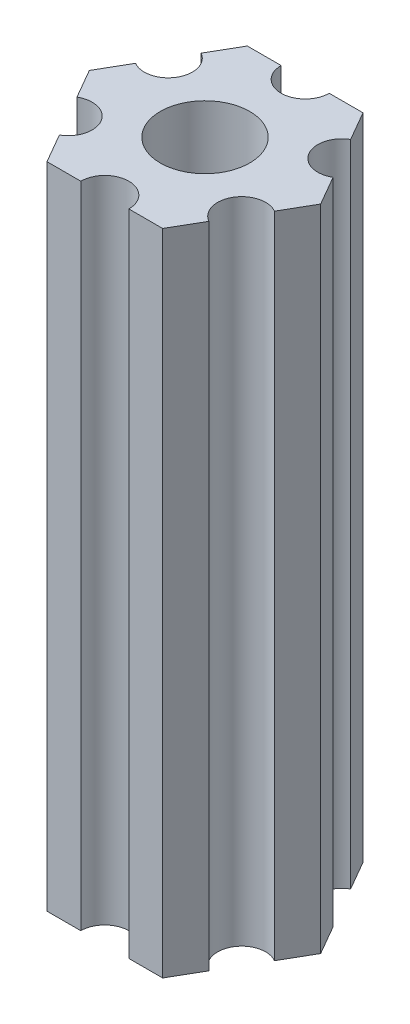
ISO-10303-21;
HEADER;
FILE_DESCRIPTION(('STEP AP214'),'2;1');
FILE_NAME('part.step','',(''),(''),'','','');
FILE_SCHEMA(('AUTOMOTIVE_DESIGN { 1 0 10303 214 1 1 1 1 }'));
ENDSEC;
DATA;
#1=APPLICATION_CONTEXT('core data for automotive mechanical design processes');
#2=APPLICATION_PROTOCOL_DEFINITION('international standard','automotive_design',2000,#1);
#3=PRODUCT_CONTEXT('',#1,'mechanical');
#4=PRODUCT('Part','Part','',(#3));
#5=PRODUCT_RELATED_PRODUCT_CATEGORY('part','',(#4));
#6=PRODUCT_DEFINITION_FORMATION('','',#4);
#7=PRODUCT_DEFINITION_CONTEXT('part definition',#1,'design');
#8=PRODUCT_DEFINITION('design','',#6,#7);
#9=PRODUCT_DEFINITION_SHAPE('','',#8);
#10=(LENGTH_UNIT() NAMED_UNIT(*) SI_UNIT(.MILLI.,.METRE.));
#11=(NAMED_UNIT(*) PLANE_ANGLE_UNIT() SI_UNIT($,.RADIAN.));
#12=(NAMED_UNIT(*) SI_UNIT($,.STERADIAN.) SOLID_ANGLE_UNIT());
#13=UNCERTAINTY_MEASURE_WITH_UNIT(LENGTH_MEASURE(1.E-05),#10,'distance_accuracy_value','');
#14=(GEOMETRIC_REPRESENTATION_CONTEXT(3) GLOBAL_UNCERTAINTY_ASSIGNED_CONTEXT((#13)) GLOBAL_UNIT_ASSIGNED_CONTEXT((#10,
#11,#12)) REPRESENTATION_CONTEXT('',''));
#15=CARTESIAN_POINT('',(0.,0.,0.));
#16=DIRECTION('',(0.,0.,1.));
#17=DIRECTION('',(1.,0.,0.));
#18=AXIS2_PLACEMENT_3D('',#15,#16,#17);
#19=CARTESIAN_POINT('',(76.3126587736527,6.,15.875));
#20=DIRECTION('',(0.,-1.,0.));
#21=DIRECTION('',(0.,0.,-1.));
#22=AXIS2_PLACEMENT_3D('',#19,#20,#21);
#23=CYLINDRICAL_SURFACE('',#22,1.50000000000002);
#24=CARTESIAN_POINT('',(76.3126587736527,-34.5,15.875));
#25=DIRECTION('',(0.,1.,0.));
#26=DIRECTION('',(0.,0.,1.));
#27=AXIS2_PLACEMENT_3D('',#24,#25,#26);
#28=CIRCLE('',#27,1.50000000000002);
#29=CARTESIAN_POINT('',(75.5626587736527,-34.5,14.5759618943233));
#30=VERTEX_POINT('',#29);
#31=CARTESIAN_POINT('',(77.0626587736528,-34.5,17.1740381056767));
#32=VERTEX_POINT('',#31);
#33=EDGE_CURVE('E190',#30,#32,#28,.T.);
#34=ORIENTED_EDGE('',*,*,#33,.F.);
#35=DIRECTION('',(0.,-1.,0.));
#36=VECTOR('',#35,1.);
#37=CARTESIAN_POINT('',(75.5626587736527,6.,14.5759618943233));
#38=LINE('',#37,#36);
#39=CARTESIAN_POINT('',(75.5626587736527,6.,14.5759618943233));
#40=VERTEX_POINT('',#39);
#41=EDGE_CURVE('E11',#40,#30,#38,.T.);
#42=ORIENTED_EDGE('',*,*,#41,.F.);
#43=CARTESIAN_POINT('',(76.3126587736527,6.,15.875));
#44=DIRECTION('',(0.,1.,0.));
#45=DIRECTION('',(0.,0.,1.));
#46=AXIS2_PLACEMENT_3D('',#43,#44,#45);
#47=CIRCLE('',#46,1.50000000000002);
#48=CARTESIAN_POINT('',(77.0626587736528,6.,17.1740381056767));
#49=VERTEX_POINT('',#48);
#50=EDGE_CURVE('E241',#40,#49,#47,.T.);
#51=ORIENTED_EDGE('',*,*,#50,.T.);
#52=DIRECTION('',(0.,-1.,0.));
#53=VECTOR('',#52,1.);
#54=CARTESIAN_POINT('',(77.0626587736528,6.,17.1740381056767));
#55=LINE('',#54,#53);
#56=EDGE_CURVE('E36',#49,#32,#55,.T.);
#57=ORIENTED_EDGE('',*,*,#56,.T.);
#58=EDGE_LOOP('',(#34,#42,#51,#57));
#59=FACE_BOUND('',#58,.T.);
#60=ADVANCED_FACE('F33',(#59),#23,.F.);
#61=CARTESIAN_POINT('',(74.5084391824352,6.,12.75));
#62=DIRECTION('',(0.866025403784455,0.,-0.499999999999972));
#63=DIRECTION('',(-0.499999999999972,0.,-0.866025403784455));
#64=AXIS2_PLACEMENT_3D('',#61,#62,#63);
#65=PLANE('',#64);
#66=DIRECTION('',(0.499999999999972,0.,0.866025403784455));
#67=VECTOR('',#66,1.);
#68=CARTESIAN_POINT('',(74.5084391824352,-34.5,12.75));
#69=LINE('',#68,#67);
#70=CARTESIAN_POINT('',(74.5084391824352,-34.5,12.75));
#71=VERTEX_POINT('',#70);
#72=EDGE_CURVE('E239',#71,#30,#69,.T.);
#73=ORIENTED_EDGE('',*,*,#72,.F.);
#74=DIRECTION('',(0.,-1.,0.));
#75=VECTOR('',#74,1.);
#76=CARTESIAN_POINT('',(74.5084391824352,6.,12.75));
#77=LINE('',#76,#75);
#78=CARTESIAN_POINT('',(74.5084391824352,6.,12.75));
#79=VERTEX_POINT('',#78);
#80=EDGE_CURVE('E42',#79,#71,#77,.T.);
#81=ORIENTED_EDGE('',*,*,#80,.F.);
#82=DIRECTION('',(0.499999999999972,0.,0.866025403784455));
#83=VECTOR('',#82,1.);
#84=CARTESIAN_POINT('',(74.5084391824352,6.,12.75));
#85=LINE('',#84,#83);
#86=EDGE_CURVE('E180',#79,#40,#85,.T.);
#87=ORIENTED_EDGE('',*,*,#86,.T.);
#88=ORIENTED_EDGE('',*,*,#41,.T.);
#89=EDGE_LOOP('',(#73,#81,#87,#88));
#90=FACE_BOUND('',#89,.T.);
#91=ADVANCED_FACE('F273',(#90),#65,.T.);
#92=CARTESIAN_POINT('',(72.4,6.,12.75));
#93=DIRECTION('',(0.,0.,-1.));
#94=DIRECTION('',(-1.,0.,0.));
#95=AXIS2_PLACEMENT_3D('',#92,#93,#94);
#96=PLANE('',#95);
#97=DIRECTION('',(1.,0.,0.));
#98=VECTOR('',#97,1.);
#99=CARTESIAN_POINT('',(72.4,-34.5,12.75));
#100=LINE('',#99,#98);
#101=CARTESIAN_POINT('',(72.4,-34.5,12.75));
#102=VERTEX_POINT('',#101);
#103=EDGE_CURVE('E167',#102,#71,#100,.T.);
#104=ORIENTED_EDGE('',*,*,#103,.F.);
#105=DIRECTION('',(0.,-1.,0.));
#106=VECTOR('',#105,1.);
#107=CARTESIAN_POINT('',(72.4,6.,12.75));
#108=LINE('',#107,#106);
#109=CARTESIAN_POINT('',(72.4,6.,12.75));
#110=VERTEX_POINT('',#109);
#111=EDGE_CURVE('E162',#110,#102,#108,.T.);
#112=ORIENTED_EDGE('',*,*,#111,.F.);
#113=DIRECTION('',(1.,0.,0.));
#114=VECTOR('',#113,1.);
#115=CARTESIAN_POINT('',(72.4,6.,12.75));
#116=LINE('',#115,#114);
#117=EDGE_CURVE('E165',#110,#79,#116,.T.);
#118=ORIENTED_EDGE('',*,*,#117,.T.);
#119=ORIENTED_EDGE('',*,*,#80,.T.);
#120=EDGE_LOOP('',(#104,#112,#118,#119));
#121=FACE_BOUND('',#120,.T.);
#122=ADVANCED_FACE('F164',(#121),#96,.T.);
#123=CARTESIAN_POINT('',(70.9,6.,12.75));
#124=DIRECTION('',(0.,-1.,0.));
#125=DIRECTION('',(0.,0.,-1.));
#126=AXIS2_PLACEMENT_3D('',#123,#124,#125);
#127=CYLINDRICAL_SURFACE('',#126,1.5);
#128=CARTESIAN_POINT('',(70.9,-34.5,12.75));
#129=DIRECTION('',(0.,1.,0.));
#130=DIRECTION('',(0.,0.,1.));
#131=AXIS2_PLACEMENT_3D('',#128,#129,#130);
#132=CIRCLE('',#131,1.5);
#133=CARTESIAN_POINT('',(69.4,-34.5,12.75));
#134=VERTEX_POINT('',#133);
#135=EDGE_CURVE('E236',#134,#102,#132,.T.);
#136=ORIENTED_EDGE('',*,*,#135,.F.);
#137=DIRECTION('',(0.,-1.,0.));
#138=VECTOR('',#137,1.);
#139=CARTESIAN_POINT('',(69.4,6.,12.75));
#140=LINE('',#139,#138);
#141=CARTESIAN_POINT('',(69.4,6.,12.75));
#142=VERTEX_POINT('',#141);
#143=EDGE_CURVE('E172',#142,#134,#140,.T.);
#144=ORIENTED_EDGE('',*,*,#143,.F.);
#145=CARTESIAN_POINT('',(70.9,6.,12.75));
#146=DIRECTION('',(0.,1.,0.));
#147=DIRECTION('',(0.,0.,1.));
#148=AXIS2_PLACEMENT_3D('',#145,#146,#147);
#149=CIRCLE('',#148,1.5);
#150=EDGE_CURVE('E178',#142,#110,#149,.T.);
#151=ORIENTED_EDGE('',*,*,#150,.T.);
#152=ORIENTED_EDGE('',*,*,#111,.T.);
#153=EDGE_LOOP('',(#136,#144,#151,#152));
#154=FACE_BOUND('',#153,.T.);
#155=ADVANCED_FACE('F182',(#154),#127,.F.);
#156=CARTESIAN_POINT('',(67.2915608175649,6.,12.75));
#157=DIRECTION('',(0.,0.,-1.));
#158=DIRECTION('',(-1.,0.,0.));
#159=AXIS2_PLACEMENT_3D('',#156,#157,#158);
#160=PLANE('',#159);
#161=DIRECTION('',(1.,0.,0.));
#162=VECTOR('',#161,1.);
#163=CARTESIAN_POINT('',(67.2915608175649,-34.5,12.75));
#164=LINE('',#163,#162);
#165=CARTESIAN_POINT('',(67.2915608175649,-34.5,12.75));
#166=VERTEX_POINT('',#165);
#167=EDGE_CURVE('E233',#166,#134,#164,.T.);
#168=ORIENTED_EDGE('',*,*,#167,.F.);
#169=DIRECTION('',(0.,-1.,0.));
#170=VECTOR('',#169,1.);
#171=CARTESIAN_POINT('',(67.2915608175649,6.,12.75));
#172=LINE('',#171,#170);
#173=CARTESIAN_POINT('',(67.2915608175649,6.,12.75));
#174=VERTEX_POINT('',#173);
#175=EDGE_CURVE('E245',#174,#166,#172,.T.);
#176=ORIENTED_EDGE('',*,*,#175,.F.);
#177=DIRECTION('',(1.,0.,0.));
#178=VECTOR('',#177,1.);
#179=CARTESIAN_POINT('',(67.2915608175649,6.,12.75));
#180=LINE('',#179,#178);
#181=EDGE_CURVE('E183',#174,#142,#180,.T.);
#182=ORIENTED_EDGE('',*,*,#181,.T.);
#183=ORIENTED_EDGE('',*,*,#143,.T.);
#184=EDGE_LOOP('',(#168,#176,#182,#183));
#185=FACE_BOUND('',#184,.T.);
#186=ADVANCED_FACE('F286',(#185),#160,.T.);
#187=CARTESIAN_POINT('',(66.2373412263473,6.,14.5759618943233));
#188=DIRECTION('',(-0.866025403784432,0.,-0.500000000000011));
#189=DIRECTION('',(-0.500000000000011,0.,0.866025403784432));
#190=AXIS2_PLACEMENT_3D('',#187,#188,#189);
#191=PLANE('',#190);
#192=DIRECTION('',(0.500000000000011,0.,-0.866025403784432));
#193=VECTOR('',#192,1.);
#194=CARTESIAN_POINT('',(66.2373412263473,-34.5,14.5759618943233));
#195=LINE('',#194,#193);
#196=CARTESIAN_POINT('',(66.2373412263473,-34.5,14.5759618943233));
#197=VERTEX_POINT('',#196);
#198=EDGE_CURVE('E230',#197,#166,#195,.T.);
#199=ORIENTED_EDGE('',*,*,#198,.F.);
#200=DIRECTION('',(0.,-1.,0.));
#201=VECTOR('',#200,1.);
#202=CARTESIAN_POINT('',(66.2373412263473,6.,14.5759618943233));
#203=LINE('',#202,#201);
#204=CARTESIAN_POINT('',(66.2373412263473,6.,14.5759618943233));
#205=VERTEX_POINT('',#204);
#206=EDGE_CURVE('E247',#205,#197,#203,.T.);
#207=ORIENTED_EDGE('',*,*,#206,.F.);
#208=DIRECTION('',(0.500000000000011,0.,-0.866025403784432));
#209=VECTOR('',#208,1.);
#210=CARTESIAN_POINT('',(66.2373412263473,6.,14.5759618943233));
#211=LINE('',#210,#209);
#212=EDGE_CURVE('E185',#205,#174,#211,.T.);
#213=ORIENTED_EDGE('',*,*,#212,.T.);
#214=ORIENTED_EDGE('',*,*,#175,.T.);
#215=EDGE_LOOP('',(#199,#207,#213,#214));
#216=FACE_BOUND('',#215,.T.);
#217=ADVANCED_FACE('F289',(#216),#191,.T.);
#218=CARTESIAN_POINT('',(65.4873412263473,6.,15.875));
#219=DIRECTION('',(0.,-1.,0.));
#220=DIRECTION('',(0.,0.,-1.));
#221=AXIS2_PLACEMENT_3D('',#218,#219,#220);
#222=CYLINDRICAL_SURFACE('',#221,1.49999999999999);
#223=CARTESIAN_POINT('',(65.4873412263473,-34.5,15.875));
#224=DIRECTION('',(0.,1.,0.));
#225=DIRECTION('',(0.,0.,1.));
#226=AXIS2_PLACEMENT_3D('',#223,#224,#225);
#227=CIRCLE('',#226,1.49999999999999);
#228=CARTESIAN_POINT('',(64.7373412263473,-34.5,17.1740381056767));
#229=VERTEX_POINT('',#228);
#230=EDGE_CURVE('E227',#229,#197,#227,.T.);
#231=ORIENTED_EDGE('',*,*,#230,.F.);
#232=DIRECTION('',(0.,-1.,0.));
#233=VECTOR('',#232,1.);
#234=CARTESIAN_POINT('',(64.7373412263473,6.,17.1740381056767));
#235=LINE('',#234,#233);
#236=CARTESIAN_POINT('',(64.7373412263473,6.,17.1740381056767));
#237=VERTEX_POINT('',#236);
#238=EDGE_CURVE('E249',#237,#229,#235,.T.);
#239=ORIENTED_EDGE('',*,*,#238,.F.);
#240=CARTESIAN_POINT('',(65.4873412263473,6.,15.875));
#241=DIRECTION('',(0.,1.,0.));
#242=DIRECTION('',(0.,0.,1.));
#243=AXIS2_PLACEMENT_3D('',#240,#241,#242);
#244=CIRCLE('',#243,1.49999999999999);
#245=EDGE_CURVE('E394',#237,#205,#244,.T.);
#246=ORIENTED_EDGE('',*,*,#245,.T.);
#247=ORIENTED_EDGE('',*,*,#206,.T.);
#248=EDGE_LOOP('',(#231,#239,#246,#247));
#249=FACE_BOUND('',#248,.T.);
#250=ADVANCED_FACE('F293',(#249),#222,.F.);
#251=CARTESIAN_POINT('',(63.6831216351297,6.,19.));
#252=DIRECTION('',(-0.866025403784433,0.,-0.50000000000001));
#253=DIRECTION('',(-0.50000000000001,0.,0.866025403784433));
#254=AXIS2_PLACEMENT_3D('',#251,#252,#253);
#255=PLANE('',#254);
#256=DIRECTION('',(0.50000000000001,0.,-0.866025403784433));
#257=VECTOR('',#256,1.);
#258=CARTESIAN_POINT('',(63.6831216351297,-34.5,19.));
#259=LINE('',#258,#257);
#260=CARTESIAN_POINT('',(63.6831216351297,-34.5,19.));
#261=VERTEX_POINT('',#260);
#262=EDGE_CURVE('E224',#261,#229,#259,.T.);
#263=ORIENTED_EDGE('',*,*,#262,.F.);
#264=DIRECTION('',(0.,-1.,0.));
#265=VECTOR('',#264,1.);
#266=CARTESIAN_POINT('',(63.6831216351297,6.,19.));
#267=LINE('',#266,#265);
#268=CARTESIAN_POINT('',(63.6831216351297,6.,19.));
#269=VERTEX_POINT('',#268);
#270=EDGE_CURVE('E251',#269,#261,#267,.T.);
#271=ORIENTED_EDGE('',*,*,#270,.F.);
#272=DIRECTION('',(0.50000000000001,0.,-0.866025403784433));
#273=VECTOR('',#272,1.);
#274=CARTESIAN_POINT('',(63.6831216351297,6.,19.));
#275=LINE('',#274,#273);
#276=EDGE_CURVE('E391',#269,#237,#275,.T.);
#277=ORIENTED_EDGE('',*,*,#276,.T.);
#278=ORIENTED_EDGE('',*,*,#238,.T.);
#279=EDGE_LOOP('',(#263,#271,#277,#278));
#280=FACE_BOUND('',#279,.T.);
#281=ADVANCED_FACE('F297',(#280),#255,.T.);
#282=CARTESIAN_POINT('',(64.7373412263473,6.,20.8259618943233));
#283=DIRECTION('',(-0.866025403784433,0.,0.50000000000001));
#284=DIRECTION('',(0.50000000000001,0.,0.866025403784433));
#285=AXIS2_PLACEMENT_3D('',#282,#283,#284);
#286=PLANE('',#285);
#287=DIRECTION('',(-0.50000000000001,0.,-0.866025403784433));
#288=VECTOR('',#287,1.);
#289=CARTESIAN_POINT('',(64.7373412263473,-34.5,20.8259618943233));
#290=LINE('',#289,#288);
#291=CARTESIAN_POINT('',(64.7373412263473,-34.5,20.8259618943234));
#292=VERTEX_POINT('',#291);
#293=EDGE_CURVE('E221',#292,#261,#290,.T.);
#294=ORIENTED_EDGE('',*,*,#293,.F.);
#295=DIRECTION('',(0.,-1.,0.));
#296=VECTOR('',#295,1.);
#297=CARTESIAN_POINT('',(64.7373412263473,6.,20.8259618943234));
#298=LINE('',#297,#296);
#299=CARTESIAN_POINT('',(64.7373412263473,6.,20.8259618943234));
#300=VERTEX_POINT('',#299);
#301=EDGE_CURVE('E253',#300,#292,#298,.T.);
#302=ORIENTED_EDGE('',*,*,#301,.F.);
#303=DIRECTION('',(-0.50000000000001,0.,-0.866025403784433));
#304=VECTOR('',#303,1.);
#305=CARTESIAN_POINT('',(64.7373412263473,6.,20.8259618943233));
#306=LINE('',#305,#304);
#307=EDGE_CURVE('E388',#300,#269,#306,.T.);
#308=ORIENTED_EDGE('',*,*,#307,.T.);
#309=ORIENTED_EDGE('',*,*,#270,.T.);
#310=EDGE_LOOP('',(#294,#302,#308,#309));
#311=FACE_BOUND('',#310,.T.);
#312=ADVANCED_FACE('F301',(#311),#286,.T.);
#313=CARTESIAN_POINT('',(65.4873412263473,6.,22.125));
#314=DIRECTION('',(0.,-1.,0.));
#315=DIRECTION('',(0.,0.,-1.));
#316=AXIS2_PLACEMENT_3D('',#313,#314,#315);
#317=CYLINDRICAL_SURFACE('',#316,1.49999999999999);
#318=CARTESIAN_POINT('',(65.4873412263473,-34.5,22.125));
#319=DIRECTION('',(0.,1.,0.));
#320=DIRECTION('',(0.,0.,1.));
#321=AXIS2_PLACEMENT_3D('',#318,#319,#320);
#322=CIRCLE('',#321,1.49999999999999);
#323=CARTESIAN_POINT('',(66.2373412263473,-34.5,23.4240381056767));
#324=VERTEX_POINT('',#323);
#325=EDGE_CURVE('E218',#324,#292,#322,.T.);
#326=ORIENTED_EDGE('',*,*,#325,.F.);
#327=DIRECTION('',(0.,-1.,0.));
#328=VECTOR('',#327,1.);
#329=CARTESIAN_POINT('',(66.2373412263473,6.,23.4240381056767));
#330=LINE('',#329,#328);
#331=CARTESIAN_POINT('',(66.2373412263473,6.,23.4240381056767));
#332=VERTEX_POINT('',#331);
#333=EDGE_CURVE('E255',#332,#324,#330,.T.);
#334=ORIENTED_EDGE('',*,*,#333,.F.);
#335=CARTESIAN_POINT('',(65.4873412263473,6.,22.125));
#336=DIRECTION('',(0.,1.,0.));
#337=DIRECTION('',(0.,0.,1.));
#338=AXIS2_PLACEMENT_3D('',#335,#336,#337);
#339=CIRCLE('',#338,1.49999999999999);
#340=EDGE_CURVE('E385',#332,#300,#339,.T.);
#341=ORIENTED_EDGE('',*,*,#340,.T.);
#342=ORIENTED_EDGE('',*,*,#301,.T.);
#343=EDGE_LOOP('',(#326,#334,#341,#342));
#344=FACE_BOUND('',#343,.T.);
#345=ADVANCED_FACE('F305',(#344),#317,.F.);
#346=CARTESIAN_POINT('',(67.2915608175649,6.,25.25));
#347=DIRECTION('',(-0.866025403784433,0.,0.500000000000009));
#348=DIRECTION('',(0.500000000000009,0.,0.866025403784434));
#349=AXIS2_PLACEMENT_3D('',#346,#347,#348);
#350=PLANE('',#349);
#351=DIRECTION('',(-0.500000000000009,0.,-0.866025403784433));
#352=VECTOR('',#351,1.);
#353=CARTESIAN_POINT('',(67.2915608175649,-34.5,25.25));
#354=LINE('',#353,#352);
#355=CARTESIAN_POINT('',(67.2915608175649,-34.5,25.25));
#356=VERTEX_POINT('',#355);
#357=EDGE_CURVE('E215',#356,#324,#354,.T.);
#358=ORIENTED_EDGE('',*,*,#357,.F.);
#359=DIRECTION('',(0.,-1.,0.));
#360=VECTOR('',#359,1.);
#361=CARTESIAN_POINT('',(67.2915608175649,6.,25.25));
#362=LINE('',#361,#360);
#363=CARTESIAN_POINT('',(67.2915608175649,6.,25.25));
#364=VERTEX_POINT('',#363);
#365=EDGE_CURVE('E257',#364,#356,#362,.T.);
#366=ORIENTED_EDGE('',*,*,#365,.F.);
#367=DIRECTION('',(-0.500000000000009,0.,-0.866025403784433));
#368=VECTOR('',#367,1.);
#369=CARTESIAN_POINT('',(67.2915608175649,6.,25.25));
#370=LINE('',#369,#368);
#371=EDGE_CURVE('E382',#364,#332,#370,.T.);
#372=ORIENTED_EDGE('',*,*,#371,.T.);
#373=ORIENTED_EDGE('',*,*,#333,.T.);
#374=EDGE_LOOP('',(#358,#366,#372,#373));
#375=FACE_BOUND('',#374,.T.);
#376=ADVANCED_FACE('F309',(#375),#350,.T.);
#377=CARTESIAN_POINT('',(69.4,6.,25.25));
#378=DIRECTION('',(0.,0.,1.));
#379=DIRECTION('',(1.,0.,0.));
#380=AXIS2_PLACEMENT_3D('',#377,#378,#379);
#381=PLANE('',#380);
#382=DIRECTION('',(-1.,0.,0.));
#383=VECTOR('',#382,1.);
#384=CARTESIAN_POINT('',(69.4,-34.5,25.25));
#385=LINE('',#384,#383);
#386=CARTESIAN_POINT('',(69.4,-34.5,25.25));
#387=VERTEX_POINT('',#386);
#388=EDGE_CURVE('E212',#387,#356,#385,.T.);
#389=ORIENTED_EDGE('',*,*,#388,.F.);
#390=DIRECTION('',(0.,-1.,0.));
#391=VECTOR('',#390,1.);
#392=CARTESIAN_POINT('',(69.4,6.,25.25));
#393=LINE('',#392,#391);
#394=CARTESIAN_POINT('',(69.4,6.,25.25));
#395=VERTEX_POINT('',#394);
#396=EDGE_CURVE('E259',#395,#387,#393,.T.);
#397=ORIENTED_EDGE('',*,*,#396,.F.);
#398=DIRECTION('',(-1.,0.,0.));
#399=VECTOR('',#398,1.);
#400=CARTESIAN_POINT('',(69.4,6.,25.25));
#401=LINE('',#400,#399);
#402=EDGE_CURVE('E379',#395,#364,#401,.T.);
#403=ORIENTED_EDGE('',*,*,#402,.T.);
#404=ORIENTED_EDGE('',*,*,#365,.T.);
#405=EDGE_LOOP('',(#389,#397,#403,#404));
#406=FACE_BOUND('',#405,.T.);
#407=ADVANCED_FACE('F313',(#406),#381,.T.);
#408=CARTESIAN_POINT('',(70.9,6.,25.25));
#409=DIRECTION('',(0.,-1.,0.));
#410=DIRECTION('',(0.,0.,-1.));
#411=AXIS2_PLACEMENT_3D('',#408,#409,#410);
#412=CYLINDRICAL_SURFACE('',#411,1.5);
#413=CARTESIAN_POINT('',(70.9,-34.5,25.25));
#414=DIRECTION('',(0.,1.,0.));
#415=DIRECTION('',(0.,0.,1.));
#416=AXIS2_PLACEMENT_3D('',#413,#414,#415);
#417=CIRCLE('',#416,1.5);
#418=CARTESIAN_POINT('',(72.4,-34.5,25.25));
#419=VERTEX_POINT('',#418);
#420=EDGE_CURVE('E209',#419,#387,#417,.T.);
#421=ORIENTED_EDGE('',*,*,#420,.F.);
#422=DIRECTION('',(0.,-1.,0.));
#423=VECTOR('',#422,1.);
#424=CARTESIAN_POINT('',(72.4,6.,25.25));
#425=LINE('',#424,#423);
#426=CARTESIAN_POINT('',(72.4,6.,25.25));
#427=VERTEX_POINT('',#426);
#428=EDGE_CURVE('E261',#427,#419,#425,.T.);
#429=ORIENTED_EDGE('',*,*,#428,.F.);
#430=CARTESIAN_POINT('',(70.9,6.,25.25));
#431=DIRECTION('',(0.,1.,0.));
#432=DIRECTION('',(0.,0.,1.));
#433=AXIS2_PLACEMENT_3D('',#430,#431,#432);
#434=CIRCLE('',#433,1.5);
#435=EDGE_CURVE('E376',#427,#395,#434,.T.);
#436=ORIENTED_EDGE('',*,*,#435,.T.);
#437=ORIENTED_EDGE('',*,*,#396,.T.);
#438=EDGE_LOOP('',(#421,#429,#436,#437));
#439=FACE_BOUND('',#438,.T.);
#440=ADVANCED_FACE('F317',(#439),#412,.F.);
#441=CARTESIAN_POINT('',(74.5084391824352,6.,25.25));
#442=DIRECTION('',(0.,0.,1.));
#443=DIRECTION('',(1.,0.,0.));
#444=AXIS2_PLACEMENT_3D('',#441,#442,#443);
#445=PLANE('',#444);
#446=DIRECTION('',(-1.,0.,0.));
#447=VECTOR('',#446,1.);
#448=CARTESIAN_POINT('',(74.5084391824352,-34.5,25.25));
#449=LINE('',#448,#447);
#450=CARTESIAN_POINT('',(74.5084391824352,-34.5,25.25));
#451=VERTEX_POINT('',#450);
#452=EDGE_CURVE('E206',#451,#419,#449,.T.);
#453=ORIENTED_EDGE('',*,*,#452,.F.);
#454=DIRECTION('',(0.,-1.,0.));
#455=VECTOR('',#454,1.);
#456=CARTESIAN_POINT('',(74.5084391824352,6.,25.25));
#457=LINE('',#456,#455);
#458=CARTESIAN_POINT('',(74.5084391824352,6.,25.25));
#459=VERTEX_POINT('',#458);
#460=EDGE_CURVE('E263',#459,#451,#457,.T.);
#461=ORIENTED_EDGE('',*,*,#460,.F.);
#462=DIRECTION('',(-1.,0.,0.));
#463=VECTOR('',#462,1.);
#464=CARTESIAN_POINT('',(74.5084391824352,6.,25.25));
#465=LINE('',#464,#463);
#466=EDGE_CURVE('E373',#459,#427,#465,.T.);
#467=ORIENTED_EDGE('',*,*,#466,.T.);
#468=ORIENTED_EDGE('',*,*,#428,.T.);
#469=EDGE_LOOP('',(#453,#461,#467,#468));
#470=FACE_BOUND('',#469,.T.);
#471=ADVANCED_FACE('F321',(#470),#445,.T.);
#472=CARTESIAN_POINT('',(75.5626587736528,6.,23.4240381056767));
#473=DIRECTION('',(0.866025403784437,0.,0.500000000000002));
#474=DIRECTION('',(0.500000000000002,0.,-0.866025403784437));
#475=AXIS2_PLACEMENT_3D('',#472,#473,#474);
#476=PLANE('',#475);
#477=DIRECTION('',(-0.500000000000002,0.,0.866025403784437));
#478=VECTOR('',#477,1.);
#479=CARTESIAN_POINT('',(75.5626587736528,-34.5,23.4240381056767));
#480=LINE('',#479,#478);
#481=CARTESIAN_POINT('',(75.5626587736528,-34.5,23.4240381056767));
#482=VERTEX_POINT('',#481);
#483=EDGE_CURVE('E203',#482,#451,#480,.T.);
#484=ORIENTED_EDGE('',*,*,#483,.F.);
#485=DIRECTION('',(0.,-1.,0.));
#486=VECTOR('',#485,1.);
#487=CARTESIAN_POINT('',(75.5626587736528,6.,23.4240381056767));
#488=LINE('',#487,#486);
#489=CARTESIAN_POINT('',(75.5626587736528,6.,23.4240381056767));
#490=VERTEX_POINT('',#489);
#491=EDGE_CURVE('E265',#490,#482,#488,.T.);
#492=ORIENTED_EDGE('',*,*,#491,.F.);
#493=DIRECTION('',(-0.500000000000002,0.,0.866025403784437));
#494=VECTOR('',#493,1.);
#495=CARTESIAN_POINT('',(75.5626587736528,6.,23.4240381056767));
#496=LINE('',#495,#494);
#497=EDGE_CURVE('E370',#490,#459,#496,.T.);
#498=ORIENTED_EDGE('',*,*,#497,.T.);
#499=ORIENTED_EDGE('',*,*,#460,.T.);
#500=EDGE_LOOP('',(#484,#492,#498,#499));
#501=FACE_BOUND('',#500,.T.);
#502=ADVANCED_FACE('F325',(#501),#476,.T.);
#503=CARTESIAN_POINT('',(76.3126587736528,6.,22.125));
#504=DIRECTION('',(0.,-1.,0.));
#505=DIRECTION('',(0.,0.,-1.));
#506=AXIS2_PLACEMENT_3D('',#503,#504,#505);
#507=CYLINDRICAL_SURFACE('',#506,1.50000000000002);
#508=CARTESIAN_POINT('',(76.3126587736528,-34.5,22.125));
#509=DIRECTION('',(0.,1.,0.));
#510=DIRECTION('',(0.,0.,1.));
#511=AXIS2_PLACEMENT_3D('',#508,#509,#510);
#512=CIRCLE('',#511,1.50000000000002);
#513=CARTESIAN_POINT('',(77.0626587736528,-34.5,20.8259618943234));
#514=VERTEX_POINT('',#513);
#515=EDGE_CURVE('E200',#514,#482,#512,.T.);
#516=ORIENTED_EDGE('',*,*,#515,.F.);
#517=DIRECTION('',(0.,-1.,0.));
#518=VECTOR('',#517,1.);
#519=CARTESIAN_POINT('',(77.0626587736528,6.,20.8259618943234));
#520=LINE('',#519,#518);
#521=CARTESIAN_POINT('',(77.0626587736528,6.,20.8259618943234));
#522=VERTEX_POINT('',#521);
#523=EDGE_CURVE('E267',#522,#514,#520,.T.);
#524=ORIENTED_EDGE('',*,*,#523,.F.);
#525=CARTESIAN_POINT('',(76.3126587736528,6.,22.125));
#526=DIRECTION('',(0.,1.,0.));
#527=DIRECTION('',(0.,0.,1.));
#528=AXIS2_PLACEMENT_3D('',#525,#526,#527);
#529=CIRCLE('',#528,1.50000000000002);
#530=EDGE_CURVE('E367',#522,#490,#529,.T.);
#531=ORIENTED_EDGE('',*,*,#530,.T.);
#532=ORIENTED_EDGE('',*,*,#491,.T.);
#533=EDGE_LOOP('',(#516,#524,#531,#532));
#534=FACE_BOUND('',#533,.T.);
#535=ADVANCED_FACE('F329',(#534),#507,.F.);
#536=CARTESIAN_POINT('',(78.1168783648703,6.,19.));
#537=DIRECTION('',(0.866025403784448,0.,0.499999999999984));
#538=DIRECTION('',(0.499999999999984,0.,-0.866025403784448));
#539=AXIS2_PLACEMENT_3D('',#536,#537,#538);
#540=PLANE('',#539);
#541=DIRECTION('',(-0.499999999999984,0.,0.866025403784448));
#542=VECTOR('',#541,1.);
#543=CARTESIAN_POINT('',(78.1168783648703,-34.5,19.));
#544=LINE('',#543,#542);
#545=CARTESIAN_POINT('',(78.1168783648703,-34.5,19.));
#546=VERTEX_POINT('',#545);
#547=EDGE_CURVE('E197',#546,#514,#544,.T.);
#548=ORIENTED_EDGE('',*,*,#547,.F.);
#549=DIRECTION('',(0.,-1.,0.));
#550=VECTOR('',#549,1.);
#551=CARTESIAN_POINT('',(78.1168783648703,6.,19.));
#552=LINE('',#551,#550);
#553=CARTESIAN_POINT('',(78.1168783648703,6.,19.));
#554=VERTEX_POINT('',#553);
#555=EDGE_CURVE('E268',#554,#546,#552,.T.);
#556=ORIENTED_EDGE('',*,*,#555,.F.);
#557=DIRECTION('',(-0.499999999999984,0.,0.866025403784448));
#558=VECTOR('',#557,1.);
#559=CARTESIAN_POINT('',(78.1168783648703,6.,19.));
#560=LINE('',#559,#558);
#561=EDGE_CURVE('E364',#554,#522,#560,.T.);
#562=ORIENTED_EDGE('',*,*,#561,.T.);
#563=ORIENTED_EDGE('',*,*,#523,.T.);
#564=EDGE_LOOP('',(#548,#556,#562,#563));
#565=FACE_BOUND('',#564,.T.);
#566=ADVANCED_FACE('F333',(#565),#540,.T.);
#567=CARTESIAN_POINT('',(77.0626587736528,6.,17.1740381056767));
#568=DIRECTION('',(0.866025403784456,0.,-0.49999999999997));
#569=DIRECTION('',(-0.49999999999997,0.,-0.866025403784456));
#570=AXIS2_PLACEMENT_3D('',#567,#568,#569);
#571=PLANE('',#570);
#572=DIRECTION('',(0.49999999999997,0.,0.866025403784456));
#573=VECTOR('',#572,1.);
#574=CARTESIAN_POINT('',(77.0626587736528,-34.5,17.1740381056767));
#575=LINE('',#574,#573);
#576=EDGE_CURVE('E193',#32,#546,#575,.T.);
#577=ORIENTED_EDGE('',*,*,#576,.F.);
#578=ORIENTED_EDGE('',*,*,#56,.F.);
#579=DIRECTION('',(0.49999999999997,0.,0.866025403784456));
#580=VECTOR('',#579,1.);
#581=CARTESIAN_POINT('',(77.0626587736528,6.,17.1740381056767));
#582=LINE('',#581,#580);
#583=EDGE_CURVE('E362',#49,#554,#582,.T.);
#584=ORIENTED_EDGE('',*,*,#583,.T.);
#585=ORIENTED_EDGE('',*,*,#555,.T.);
#586=EDGE_LOOP('',(#577,#578,#584,#585));
#587=FACE_BOUND('',#586,.T.);
#588=ADVANCED_FACE('F270',(#587),#571,.T.);
#589=CARTESIAN_POINT('',(76.3126587736527,6.,15.875));
#590=DIRECTION('',(0.,1.,0.));
#591=DIRECTION('',(0.,0.,1.));
#592=AXIS2_PLACEMENT_3D('',#589,#590,#591);
#593=PLANE('',#592);
#594=CARTESIAN_POINT('',(70.9,6.,19.));
#595=DIRECTION('',(0.,-1.,0.));
#596=DIRECTION('',(0.,0.,1.));
#597=AXIS2_PLACEMENT_3D('',#594,#595,#596);
#598=CIRCLE('',#597,2.79);
#599=CARTESIAN_POINT('',(70.9,6.,21.79));
#600=VERTEX_POINT('',#599);
#601=EDGE_CURVE('E194',#600,#600,#598,.T.);
#602=ORIENTED_EDGE('',*,*,#601,.T.);
#603=EDGE_LOOP('',(#602));
#604=FACE_BOUND('',#603,.T.);
#605=ORIENTED_EDGE('',*,*,#50,.F.);
#606=ORIENTED_EDGE('',*,*,#86,.F.);
#607=ORIENTED_EDGE('',*,*,#117,.F.);
#608=ORIENTED_EDGE('',*,*,#150,.F.);
#609=ORIENTED_EDGE('',*,*,#181,.F.);
#610=ORIENTED_EDGE('',*,*,#212,.F.);
#611=ORIENTED_EDGE('',*,*,#245,.F.);
#612=ORIENTED_EDGE('',*,*,#276,.F.);
#613=ORIENTED_EDGE('',*,*,#307,.F.);
#614=ORIENTED_EDGE('',*,*,#340,.F.);
#615=ORIENTED_EDGE('',*,*,#371,.F.);
#616=ORIENTED_EDGE('',*,*,#402,.F.);
#617=ORIENTED_EDGE('',*,*,#435,.F.);
#618=ORIENTED_EDGE('',*,*,#466,.F.);
#619=ORIENTED_EDGE('',*,*,#497,.F.);
#620=ORIENTED_EDGE('',*,*,#530,.F.);
#621=ORIENTED_EDGE('',*,*,#561,.F.);
#622=ORIENTED_EDGE('',*,*,#583,.F.);
#623=EDGE_LOOP('',(#605,#606,#607,#608,#609,#610,#611,#612,#613,#614,#615,#616,#617,#618,#619,
#620,#621,#622));
#624=FACE_BOUND('',#623,.T.);
#625=ADVANCED_FACE('F176',(#604,#624),#593,.T.);
#626=CARTESIAN_POINT('',(76.3126587736527,-34.5,15.875));
#627=DIRECTION('',(0.,1.,0.));
#628=DIRECTION('',(0.,0.,1.));
#629=AXIS2_PLACEMENT_3D('',#626,#627,#628);
#630=PLANE('',#629);
#631=CARTESIAN_POINT('',(70.9,-34.5,19.));
#632=DIRECTION('',(0.,-1.,0.));
#633=DIRECTION('',(0.,0.,1.));
#634=AXIS2_PLACEMENT_3D('',#631,#632,#633);
#635=CIRCLE('',#634,2.79);
#636=CARTESIAN_POINT('',(70.9,-34.5,21.79));
#637=VERTEX_POINT('',#636);
#638=EDGE_CURVE('E357',#637,#637,#635,.T.);
#639=ORIENTED_EDGE('',*,*,#638,.F.);
#640=EDGE_LOOP('',(#639));
#641=FACE_BOUND('',#640,.T.);
#642=ORIENTED_EDGE('',*,*,#33,.T.);
#643=ORIENTED_EDGE('',*,*,#576,.T.);
#644=ORIENTED_EDGE('',*,*,#547,.T.);
#645=ORIENTED_EDGE('',*,*,#515,.T.);
#646=ORIENTED_EDGE('',*,*,#483,.T.);
#647=ORIENTED_EDGE('',*,*,#452,.T.);
#648=ORIENTED_EDGE('',*,*,#420,.T.);
#649=ORIENTED_EDGE('',*,*,#388,.T.);
#650=ORIENTED_EDGE('',*,*,#357,.T.);
#651=ORIENTED_EDGE('',*,*,#325,.T.);
#652=ORIENTED_EDGE('',*,*,#293,.T.);
#653=ORIENTED_EDGE('',*,*,#262,.T.);
#654=ORIENTED_EDGE('',*,*,#230,.T.);
#655=ORIENTED_EDGE('',*,*,#198,.T.);
#656=ORIENTED_EDGE('',*,*,#167,.T.);
#657=ORIENTED_EDGE('',*,*,#135,.T.);
#658=ORIENTED_EDGE('',*,*,#103,.T.);
#659=ORIENTED_EDGE('',*,*,#72,.T.);
#660=EDGE_LOOP('',(#642,#643,#644,#645,#646,#647,#648,#649,#650,#651,#652,#653,#654,#655,#656,
#657,#658,#659));
#661=FACE_BOUND('',#660,.T.);
#662=ADVANCED_FACE('F272',(#641,#661),#630,.F.);
#663=CARTESIAN_POINT('',(70.9,6.,19.));
#664=DIRECTION('',(0.,-1.,0.));
#665=DIRECTION('',(0.,0.,-1.));
#666=AXIS2_PLACEMENT_3D('',#663,#664,#665);
#667=CYLINDRICAL_SURFACE('',#666,2.79);
#668=ORIENTED_EDGE('',*,*,#601,.F.);
#669=EDGE_LOOP('',(#668));
#670=FACE_BOUND('',#669,.T.);
#671=ORIENTED_EDGE('',*,*,#638,.T.);
#672=EDGE_LOOP('',(#671));
#673=FACE_BOUND('',#672,.T.);
#674=ADVANCED_FACE('F345',(#670,#673),#667,.F.);
#675=CLOSED_SHELL('',(#60,#91,#122,#155,#186,#217,#250,#281,#312,#345,#376,#407,#440,#471,#502,
#535,#566,#588,#625,#662,#674));
#676=MANIFOLD_SOLID_BREP('B2',#675);
#677=ADVANCED_BREP_SHAPE_REPRESENTATION('',(#18,#676),#14);
#678=SHAPE_DEFINITION_REPRESENTATION(#9,#677);
ENDSEC;
END-ISO-10303-21;
